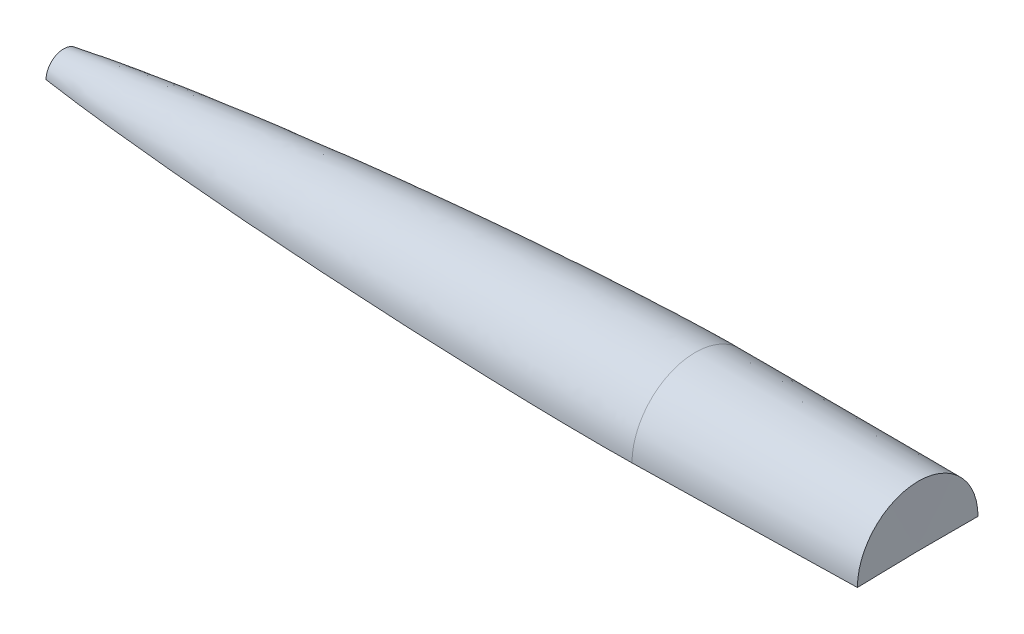
ISO-10303-21;
HEADER;
FILE_DESCRIPTION(('STEP AP214'),'2;1');
FILE_NAME('part.step','',(''),(''),'','','');
FILE_SCHEMA(('AUTOMOTIVE_DESIGN { 1 0 10303 214 1 1 1 1 }'));
ENDSEC;
DATA;
#1=APPLICATION_CONTEXT('core data for automotive mechanical design processes');
#2=APPLICATION_PROTOCOL_DEFINITION('international standard','automotive_design',2000,#1);
#3=PRODUCT_CONTEXT('',#1,'mechanical');
#4=PRODUCT('Part','Part','',(#3));
#5=PRODUCT_RELATED_PRODUCT_CATEGORY('part','',(#4));
#6=PRODUCT_DEFINITION_FORMATION('','',#4);
#7=PRODUCT_DEFINITION_CONTEXT('part definition',#1,'design');
#8=PRODUCT_DEFINITION('design','',#6,#7);
#9=PRODUCT_DEFINITION_SHAPE('','',#8);
#10=(LENGTH_UNIT() NAMED_UNIT(*) SI_UNIT(.MILLI.,.METRE.));
#11=(NAMED_UNIT(*) PLANE_ANGLE_UNIT() SI_UNIT($,.RADIAN.));
#12=(NAMED_UNIT(*) SI_UNIT($,.STERADIAN.) SOLID_ANGLE_UNIT());
#13=UNCERTAINTY_MEASURE_WITH_UNIT(LENGTH_MEASURE(1.E-05),#10,'distance_accuracy_value','');
#14=(GEOMETRIC_REPRESENTATION_CONTEXT(3) GLOBAL_UNCERTAINTY_ASSIGNED_CONTEXT((#13)) GLOBAL_UNIT_ASSIGNED_CONTEXT((#10,
#11,#12)) REPRESENTATION_CONTEXT('',''));
#15=CARTESIAN_POINT('',(0.,0.,0.));
#16=DIRECTION('',(0.,0.,1.));
#17=DIRECTION('',(1.,0.,0.));
#18=AXIS2_PLACEMENT_3D('',#15,#16,#17);
#19=CARTESIAN_POINT('',(85.2832414742339,0.,9.93858182353595));
#20=DIRECTION('',(-0.999941138636794,0.,0.0108498507709177));
#21=DIRECTION('',(0.0108498507709177,0.,0.999941138636794));
#22=AXIS2_PLACEMENT_3D('',#19,#20,#21);
#23=CONICAL_SURFACE('',#22,21.6958521235403,1.41154456510451);
#24=CARTESIAN_POINT('',(87.6480523424266,-0.000200000000151501,17.3896605987785));
#25=CARTESIAN_POINT('',(87.6480526553151,0.210415281306257,17.3896888757842));
#26=CARTESIAN_POINT('',(87.6479537572972,0.421027540842986,17.3807878736566));
#27=CARTESIAN_POINT('',(87.6475593475226,0.840745714185644,17.3452908831575));
#28=CARTESIAN_POINT('',(87.6472638452042,1.04985169981512,17.3186957442159));
#29=CARTESIAN_POINT('',(87.6464783113491,1.46493128724422,17.2479989316907));
#30=CARTESIAN_POINT('',(87.6459884169852,1.6709069917376,17.2039096028855));
#31=CARTESIAN_POINT('',(87.6448176461269,2.07841149002968,17.098545280126));
#32=CARTESIAN_POINT('',(87.644136771948,2.27994033771274,17.0372704945384));
#33=CARTESIAN_POINT('',(87.6425886086647,2.67717925033431,16.8979484522448));
#34=CARTESIAN_POINT('',(87.6417212658155,2.87288761911996,16.8198963599188));
#35=CARTESIAN_POINT('',(87.6398060694397,3.25710491527235,16.6475537315265));
#36=CARTESIAN_POINT('',(87.6387581493413,3.44561115606781,16.5532572067662));
#37=CARTESIAN_POINT('',(87.6364898805273,3.81393535129549,16.349156116946));
#38=CARTESIAN_POINT('',(87.6352695989856,3.99375665400958,16.239357593426));
#39=CARTESIAN_POINT('',(87.6326649167601,4.34351419852241,16.00500365783));
#40=CARTESIAN_POINT('',(87.631280513521,4.51345028635001,15.8804480159902));
#41=CARTESIAN_POINT('',(87.628357346615,4.84223308328939,15.6174615809414));
#42=CARTESIAN_POINT('',(87.6268185769678,5.00107936237288,15.4790302501828));
#43=CARTESIAN_POINT('',(87.6235975798958,5.30655009260982,15.1892771506882));
#44=CARTESIAN_POINT('',(87.6219153490837,5.45317425503821,15.0379550776028));
#45=CARTESIAN_POINT('',(87.6184194331488,5.7331500640402,14.7235041632565));
#46=CARTESIAN_POINT('',(87.6166057522642,5.86650213821614,14.5603757026684));
#47=CARTESIAN_POINT('',(87.6128590874273,6.11903540570978,14.22340878024));
#48=CARTESIAN_POINT('',(87.6109260623726,6.23821167502938,14.0495666286211));
#49=CARTESIAN_POINT('',(87.6069556666006,6.46145403096587,13.6925211562301));
#50=CARTESIAN_POINT('',(87.6049183318822,6.5655252836356,13.5093210650763));
#51=CARTESIAN_POINT('',(87.6007523818254,6.75790233454696,13.1347378934686));
#52=CARTESIAN_POINT('',(87.5986237331649,6.84620231580727,12.9433518258747));
#53=CARTESIAN_POINT('',(87.5942915230514,7.00634123259561,12.5538713302434));
#54=CARTESIAN_POINT('',(87.5920879810968,7.07818441550769,12.3557786483199));
#55=CARTESIAN_POINT('',(87.5876210504409,7.2049298367242,11.9542418180736));
#56=CARTESIAN_POINT('',(87.5853576604693,7.25983171512406,11.7507975561605));
#57=CARTESIAN_POINT('',(87.5807869988764,7.35230530566724,11.339994558888));
#58=CARTESIAN_POINT('',(87.5784797244466,7.389875904727,11.1326355729997));
#59=CARTESIAN_POINT('',(87.5738378190722,7.4474147925648,10.7154896517117));
#60=CARTESIAN_POINT('',(87.5715031880899,7.46738305715052,10.5057027129756));
#61=CARTESIAN_POINT('',(87.5668230832784,7.48957565631046,10.085185522886));
#62=CARTESIAN_POINT('',(87.5644776090923,7.49179940241313,9.87445524047966));
#63=CARTESIAN_POINT('',(87.5597926185946,7.47848576328997,9.45356091703578));
#64=CARTESIAN_POINT('',(87.5574531021578,7.46294875469947,9.24339686408548));
#65=CARTESIAN_POINT('',(87.5527961471814,7.41421972325694,8.82508252300462));
#66=CARTESIAN_POINT('',(87.5504787131656,7.38102415880809,8.6169326473668));
#67=CARTESIAN_POINT('',(87.5458836887959,7.29722630923078,8.20424115738842));
#68=CARTESIAN_POINT('',(87.5436060849731,7.24663003273592,7.99969832309921));
#69=CARTESIAN_POINT('',(87.5391057000455,7.12837705328439,7.59556427874549));
#70=CARTESIAN_POINT('',(87.5368829289407,7.06071726328038,7.39597397185239));
#71=CARTESIAN_POINT('',(87.5325085193619,6.90882446207005,7.0032071370691));
#72=CARTESIAN_POINT('',(87.530356879229,6.82459183770183,6.8100304595969));
#73=CARTESIAN_POINT('',(87.5261399363026,6.64014793770979,6.43145310921139));
#74=CARTESIAN_POINT('',(87.5240746364046,6.53993612677,6.24605269707232));
#75=CARTESIAN_POINT('',(87.5200452047681,6.324249904479,5.8843559551675));
#76=CARTESIAN_POINT('',(87.5180810714492,6.20877573164065,5.7080594831896));
#77=CARTESIAN_POINT('',(87.5142676719893,5.96336681153742,5.36579662851766));
#78=CARTESIAN_POINT('',(87.5124184223148,5.83342999872927,5.19983172666203));
#79=CARTESIAN_POINT('',(87.5088489531208,5.56008375618047,4.87949930200038));
#80=CARTESIAN_POINT('',(87.5071286862114,5.41667931868737,4.72512751968741));
#81=CARTESIAN_POINT('',(87.5038284080541,5.11734982315833,4.42898476219655));
#82=CARTESIAN_POINT('',(87.5022484216208,4.96142255918056,4.28721601639753));
#83=CARTESIAN_POINT('',(87.4992408468102,4.63823396239048,4.01736495235889));
#84=CARTESIAN_POINT('',(87.497813205904,4.47097656894531,3.88927791664152));
#85=CARTESIAN_POINT('',(87.4951192016854,4.12618051164247,3.64758315685438));
#86=CARTESIAN_POINT('',(87.4938529204051,3.94863668456015,3.53398279749386));
#87=CARTESIAN_POINT('',(87.4914915677112,3.58461300885287,3.32214889217062));
#88=CARTESIAN_POINT('',(87.4903964910751,3.3981334330303,3.22391487747371));
#89=CARTESIAN_POINT('',(87.4883847502724,3.01745056491863,3.04345654548871));
#90=CARTESIAN_POINT('',(87.48746818892,2.82324289878656,2.96124145414801));
#91=CARTESIAN_POINT('',(87.4858208396304,2.42858975201066,2.81347843627318));
#92=CARTESIAN_POINT('',(87.48509004765,2.22814440723753,2.74793014698339));
#93=CARTESIAN_POINT('',(87.4838202597041,1.82270576250795,2.63403861273785));
#94=CARTESIAN_POINT('',(87.4832810196751,1.61771860600182,2.58567347406992));
#95=CARTESIAN_POINT('',(87.482397085506,1.20448072951114,2.50639312559181));
#96=CARTESIAN_POINT('',(87.4820522958786,0.996231663056058,2.47546935098199));
#97=CARTESIAN_POINT('',(87.481651641886,0.656241349420404,2.43953533770414));
#98=CARTESIAN_POINT('',(87.481535936016,0.525044113814339,2.42915792137693));
#99=CARTESIAN_POINT('',(87.4813818409092,0.262502439870407,2.41533748528493));
#100=CARTESIAN_POINT('',(87.4813433241502,0.131158603599644,2.41188302827192));
#101=CARTESIAN_POINT('',(87.4813433802164,-0.000200000000151515,2.41188804094604));
#102=B_SPLINE_CURVE_WITH_KNOTS('',3,(#24,#25,#26,#27,#28,#29,#30,#31,#32,#33,#34,#35,#36,#37,
#38,#39,#40,#41,#42,#43,#44,#45,#46,#47,#48,#49,#50,#51,#52,#53,#54,#55,#56,#57,#58,#59,#60,#61,
#62,#63,#64,#65,#66,#67,#68,#69,#70,#71,#72,#73,#74,#75,#76,#77,#78,#79,#80,#81,#82,#83,#84,#85,
#86,#87,#88,#89,#90,#91,#92,#93,#94,#95,#96,#97,#98,#99,#100,#101),.UNSPECIFIED.,.F.,.F.,(4,2,2,
2,2,2,2,2,2,2,2,2,2,2,2,2,2,2,2,2,2,2,2,2,2,2,2,2,2,2,2,2,2,2,2,2,2,2,4),(0.,0.631652981165051,
1.26327564120089,1.89445338697916,2.52562348031841,3.15697573645456,3.78856124781162,
4.41990128954022,5.05125116232801,5.68262550331749,6.31401475514209,6.94538365817347,
7.57697123214299,8.20834228583879,8.83994573192171,9.47138598145941,10.1028396445202,
10.7343338563972,11.365828936187,11.9973449585201,12.6288475891452,13.2604769216032,
13.8918883649944,14.5234141223017,15.1549251404742,15.7864573192352,16.4179796298813,
17.0495922500764,17.6809716581375,18.312462530976,18.9437349569636,19.5753270393901,
20.2068998520052,20.8388353447083,21.4707570820546,22.1018707514676,22.732674234196,
23.1273275190851,23.5213282678744),.UNSPECIFIED.);
#103=CARTESIAN_POINT('',(87.6480523424563,0.,17.3896606014491));
#104=VERTEX_POINT('',#103);
#105=CARTESIAN_POINT('',(87.4813433801873,0.,2.41188803827542));
#106=VERTEX_POINT('',#105);
#107=EDGE_CURVE('E91',#104,#106,#102,.T.);
#108=ORIENTED_EDGE('',*,*,#107,.F.);
#109=DIRECTION('',(0.147857587515128,0.,-0.989008662153273));
#110=VECTOR('',#109,1.);
#111=CARTESIAN_POINT('',(88.7676468426298,0.,9.90077431986226));
#112=LINE('',#111,#110);
#113=CARTESIAN_POINT('',(85.5186382321224,-1.51501325639282E-13,31.6331568996443));
#114=VERTEX_POINT('',#113);
#115=EDGE_CURVE('E97',#114,#104,#112,.T.);
#116=ORIENTED_EDGE('',*,*,#115,.F.);
#117=CARTESIAN_POINT('',(85.2832414742339,0.,9.93858182353595));
#118=DIRECTION('',(-0.999941138636794,0.,0.0108498507709177));
#119=DIRECTION('',(0.0108498507709177,0.,0.999941138636794));
#120=AXIS2_PLACEMENT_3D('',#117,#118,#119);
#121=CIRCLE('',#120,21.6958521235403);
#122=CARTESIAN_POINT('',(85.0478447163463,0.,-11.7559932525724));
#123=VERTEX_POINT('',#122);
#124=EDGE_CURVE('E86',#114,#123,#121,.T.);
#125=ORIENTED_EDGE('',*,*,#124,.T.);
#126=DIRECTION('',(0.169282705698987,0.,0.985567534749004));
#127=VECTOR('',#126,1.);
#128=CARTESIAN_POINT('',(88.7676468426303,0.,9.90077431986226));
#129=LINE('',#128,#127);
#130=EDGE_CURVE('E120',#123,#106,#129,.T.);
#131=ORIENTED_EDGE('',*,*,#130,.T.);
#132=EDGE_LOOP('',(#108,#116,#125,#131));
#133=FACE_BOUND('',#132,.T.);
#134=ADVANCED_FACE('F33',(#133),#23,.F.);
#135=CARTESIAN_POINT('',(468.501456449085,-4.30429188083782E-13,67.4240146336954));
#136=DIRECTION('',(0.,-1.,0.));
#137=DIRECTION('',(-0.0216984242678215,0.,-0.999764561476498));
#138=AXIS2_PLACEMENT_3D('',#135,#136,#137);
#139=PLANE('',#138);
#140=ORIENTED_EDGE('',*,*,#115,.T.);
#141=DIRECTION('',(-1.,0.,0.));
#142=VECTOR('',#141,1.);
#143=CARTESIAN_POINT('',(314.706000000001,0.,17.3896606014491));
#144=LINE('',#143,#142);
#145=CARTESIAN_POINT('',(314.706000000001,0.,17.3896606014491));
#146=VERTEX_POINT('',#145);
#147=EDGE_CURVE('E11',#104,#146,#144,.F.);
#148=ORIENTED_EDGE('',*,*,#147,.T.);
#149=DIRECTION('',(0.,0.,1.));
#150=VECTOR('',#149,1.);
#151=CARTESIAN_POINT('',(314.706000000001,-4.18777013281705E-13,67.4240146336954));
#152=LINE('',#151,#150);
#153=CARTESIAN_POINT('',(314.706000000001,0.,2.41188803827543));
#154=VERTEX_POINT('',#153);
#155=EDGE_CURVE('E82',#154,#146,#152,.T.);
#156=ORIENTED_EDGE('',*,*,#155,.F.);
#157=DIRECTION('',(-1.,0.,0.));
#158=VECTOR('',#157,1.);
#159=CARTESIAN_POINT('',(314.706000000001,0.,2.41188803827542));
#160=LINE('',#159,#158);
#161=EDGE_CURVE('E41',#154,#106,#160,.T.);
#162=ORIENTED_EDGE('',*,*,#161,.T.);
#163=ORIENTED_EDGE('',*,*,#130,.F.);
#164=CARTESIAN_POINT('',(851.304580950282,0.,-76.1999999830612));
#165=CARTESIAN_POINT('',(848.604594276337,0.,-76.2013219129743));
#166=CARTESIAN_POINT('',(843.204698036428,0.,-76.1660349983795));
#167=CARTESIAN_POINT('',(832.405478937972,0.,-76.0378907584847));
#168=CARTESIAN_POINT('',(814.624980968994,0.,-75.6938189446404));
#169=CARTESIAN_POINT('',(792.56509769967,0.,-75.1093999668115));
#170=CARTESIAN_POINT('',(759.248611408171,0.,-73.992649860006));
#171=CARTESIAN_POINT('',(724.359891248075,0.,-72.534917853722));
#172=CARTESIAN_POINT('',(689.4818891808,0.,-70.8434913147738));
#173=CARTESIAN_POINT('',(647.641366115943,0.,-68.5634656214354));
#174=CARTESIAN_POINT('',(612.785340126742,0.,-66.4682371905843));
#175=CARTESIAN_POINT('',(577.94073898453,0.,-64.1913363512685));
#176=CARTESIAN_POINT('',(543.108107681937,0.,-61.7397439146533));
#177=CARTESIAN_POINT('',(515.249450887889,0.,-59.6753861650244));
#178=CARTESIAN_POINT('',(487.398559467614,0.,-57.5087840183481));
#179=CARTESIAN_POINT('',(459.55581534976,0.,-55.2398820829972));
#180=CARTESIAN_POINT('',(431.721669201162,0.,-52.8677956970107));
#181=CARTESIAN_POINT('',(403.89666678628,0.,-50.3907530559097));
#182=CARTESIAN_POINT('',(376.081450756032,0.,-47.80604215935));
#183=CARTESIAN_POINT('',(348.276817570687,0.,-45.1098832754561));
#184=CARTESIAN_POINT('',(320.483705769577,0.,-42.2972398123971));
#185=CARTESIAN_POINT('',(292.703329318698,0.,-39.361555725817));
#186=CARTESIAN_POINT('',(264.937120956625,0.,-36.2943227731371));
#187=CARTESIAN_POINT('',(237.187067415558,0.,-33.0845211743661));
#188=CARTESIAN_POINT('',(212.921947060124,0.,-30.1384681896362));
#189=CARTESIAN_POINT('',(192.13714102651,0.,-27.5029564807863));
#190=CARTESIAN_POINT('',(174.826871572784,0.,-25.2246560341365));
#191=CARTESIAN_POINT('',(160.98620549934,0.,-23.3487950499337));
#192=CARTESIAN_POINT('',(148.881759565782,0.,-21.6563308432943));
#193=CARTESIAN_POINT('',(138.513733131288,0.,-20.1657112781232));
#194=CARTESIAN_POINT('',(129.875476740705,0.,-18.893918943189));
#195=CARTESIAN_POINT('',(122.97234892004,0.,-17.8586913852302));
#196=CARTESIAN_POINT('',(116.925319179086,0.,-16.9338921590306));
#197=CARTESIAN_POINT('',(111.760486229086,0.,-16.1307134136344));
#198=CARTESIAN_POINT('',(107.431246219697,0.,-15.4474404699468));
#199=CARTESIAN_POINT('',(104.017067052322,0.,-14.9032668481449));
#200=CARTESIAN_POINT('',(100.505753232817,0.,-14.3361510709931));
#201=CARTESIAN_POINT('',(97.1703246727495,0.,-13.7927159762813));
#202=CARTESIAN_POINT('',(93.5370616124189,0.,-13.1912958461169));
#203=CARTESIAN_POINT('',(90.4166105959484,0.,-12.6708073688816));
#204=CARTESIAN_POINT('',(87.4028362576501,0.,-12.1591367577616));
#205=CARTESIAN_POINT('',(85.8325870913336,0.,-11.890781897519));
#206=CARTESIAN_POINT('',(85.0478447425106,0.,-11.7559932570664));
#207=B_SPLINE_CURVE_WITH_KNOTS('',4,(#164,#165,#166,#167,#168,#169,#170,#171,#172,#173,#174,
#175,#176,#177,#178,#179,#180,#181,#182,#183,#184,#185,#186,#187,#188,#189,#190,#191,#192,#193,
#194,#195,#196,#197,#198,#199,#200,#201,#202,#203,#204,#205,#206),.UNSPECIFIED.,.F.,.F.,(5,1,1,
1,1,1,1,1,1,1,1,1,1,1,1,1,1,1,1,1,1,1,1,1,1,1,1,1,1,1,1,1,1,1,1,1,1,1,1,5),(0.0879001619214621,
0.100701312225803,0.113502462530143,0.139104763138825,0.172216118418551,0.205327473698278,
0.271550183817795,0.30466153934024,0.337772894862686,0.403995604811727,0.437106960211499,
0.47021831561127,0.503329670637559,0.536441025663847,0.569552381231309,0.602663736798771,
0.635775091550015,0.668886446301259,0.701997801637405,0.735109156973551,0.768220512578417,
0.801331868183284,0.834443222794012,0.867554577404739,0.884110254697725,0.900665931990712,
0.917221609283698,0.933777286576684,0.942055125749807,0.95033296492293,0.958610804096053,
0.966888643269176,0.971027562855737,0.975166482442299,0.97930540202886,0.983444321615422,
0.987583241201983,0.991722160788545,0.995861080375106,1.),.UNSPECIFIED.);
#208=CARTESIAN_POINT('',(851.304580923926,0.,-76.1999999808446));
#209=VERTEX_POINT('',#208);
#210=EDGE_CURVE('E123',#209,#123,#207,.T.);
#211=ORIENTED_EDGE('',*,*,#210,.F.);
#212=DIRECTION('',(-1.,0.,0.));
#213=VECTOR('',#212,1.);
#214=CARTESIAN_POINT('',(851.304580923926,0.,-76.1999999808446));
#215=LINE('',#214,#213);
#216=CARTESIAN_POINT('',(1122.35148772108,0.,-76.1999999808446));
#217=VERTEX_POINT('',#216);
#218=EDGE_CURVE('E106',#217,#209,#215,.T.);
#219=ORIENTED_EDGE('',*,*,#218,.F.);
#220=DIRECTION('',(0.,0.,-1.));
#221=VECTOR('',#220,1.);
#222=CARTESIAN_POINT('',(1122.35148772108,0.,-1.31411623664723));
#223=LINE('',#222,#221);
#224=CARTESIAN_POINT('',(1122.35148772108,0.,-1.31411623664722));
#225=VERTEX_POINT('',#224);
#226=EDGE_CURVE('E122',#225,#217,#223,.T.);
#227=ORIENTED_EDGE('',*,*,#226,.F.);
#228=DIRECTION('',(0.0216984242678186,0.,0.999764561476498));
#229=VECTOR('',#228,1.);
#230=CARTESIAN_POINT('',(1122.35148772108,0.,-1.31411623664722));
#231=LINE('',#230,#229);
#232=CARTESIAN_POINT('',(1123.97639339823,-5.2289455117343E-13,73.5541364856503));
#233=VERTEX_POINT('',#232);
#234=EDGE_CURVE('E101',#225,#233,#231,.T.);
#235=ORIENTED_EDGE('',*,*,#234,.T.);
#236=DIRECTION('',(-0.999764561476498,0.,0.0216984242678215));
#237=VECTOR('',#236,1.);
#238=CARTESIAN_POINT('',(852.993301484615,-5.43430176935614E-13,79.4354272658155));
#239=LINE('',#238,#237);
#240=CARTESIAN_POINT('',(852.993301484615,-5.43430176935614E-13,79.4354272658155));
#241=VERTEX_POINT('',#240);
#242=EDGE_CURVE('E104',#233,#241,#239,.T.);
#243=ORIENTED_EDGE('',*,*,#242,.T.);
#244=CARTESIAN_POINT('',(852.993301511013,-5.43430176949094E-13,79.4354272674598));
#245=CARTESIAN_POINT('',(850.293979201739,-5.43643969461433E-13,79.4953343425083));
#246=CARTESIAN_POINT('',(844.894588634984,-5.43806695052536E-13,79.5772249754284));
#247=CARTESIAN_POINT('',(834.095131560643,-5.43730114426701E-13,79.6834369433836));
#248=CARTESIAN_POINT('',(816.311353989659,-5.42674738694252E-13,79.7252549259232));
#249=CARTESIAN_POINT('',(794.243983495749,-5.40265350263751E-13,79.619638249312));
#250=CARTESIAN_POINT('',(760.911109470972,-5.34991778660453E-13,79.2260663231687));
#251=CARTESIAN_POINT('',(725.998972972097,-5.27456402220743E-13,78.525707775351));
#252=CARTESIAN_POINT('',(691.092481239471,-5.18288429589466E-13,77.5914771498395));
#253=CARTESIAN_POINT('',(649.212336080751,-5.05538042118876E-13,76.2198616834327));
#254=CARTESIAN_POINT('',(614.319053387414,-4.93548836922778E-13,74.8814473902736));
#255=CARTESIAN_POINT('',(579.433250846219,-4.80290229157733E-13,73.3611555601563));
#256=CARTESIAN_POINT('',(544.555624794088,-4.65810921407391E-13,71.6659535352129));
#257=CARTESIAN_POINT('',(516.658733690771,-4.53507122937055E-13,70.2065707695734));
#258=CARTESIAN_POINT('',(488.767387590652,-4.40488809346735E-13,68.6447991827818));
#259=CARTESIAN_POINT('',(460.881967130548,-4.26755564925048E-13,66.980575109002));
#260=CARTESIAN_POINT('',(433.002903675419,-4.12301178329793E-13,65.2130043157968));
#261=CARTESIAN_POINT('',(405.130704415866,-3.97113236495323E-13,63.340303573609));
#262=CARTESIAN_POINT('',(377.265953005368,-3.81172754049289E-13,61.359747576092));
#263=CARTESIAN_POINT('',(349.40936370245,-3.64453278475544E-13,59.2675401993316));
#264=CARTESIAN_POINT('',(321.561765539371,-3.46919570403894E-13,57.0586256724802));
#265=CARTESIAN_POINT('',(293.724229940478,-3.28525759940952E-13,54.7264231535778));
#266=CARTESIAN_POINT('',(265.89800469157,-3.09212329293301E-13,52.2623953150446));
#267=CARTESIAN_POINT('',(238.08483694523,-2.88902181754984E-13,49.6554818624115));
#268=CARTESIAN_POINT('',(213.761504826327,-2.7016963970029E-13,47.2366373684285));
#269=CARTESIAN_POINT('',(192.924405885535,-2.53341785251468E-13,45.0527437002057));
#270=CARTESIAN_POINT('',(175.568776406391,-2.38744931743984E-13,43.1505852240464));
#271=CARTESIAN_POINT('',(161.690665731429,-2.26695261181586E-13,41.5754865343949));
#272=CARTESIAN_POINT('',(149.552345844334,-2.15794624929653E-13,40.1460682024226));
#273=CARTESIAN_POINT('',(139.154416346929,-2.06171821046483E-13,38.8807694229167));
#274=CARTESIAN_POINT('',(130.490597845012,-1.97945935125325E-13,37.7967130689891));
#275=CARTESIAN_POINT('',(123.566632479803,-1.91240414518526E-13,36.9115162397058));
#276=CARTESIAN_POINT('',(117.50095975663,-1.85241103938886E-13,36.1181457637499));
#277=CARTESIAN_POINT('',(112.319915094093,-1.80024175799744E-13,35.4272248541932));
#278=CARTESIAN_POINT('',(107.976868408357,-1.75581188164672E-13,34.8380504657595));
#279=CARTESIAN_POINT('',(104.551685360163,-1.72040139965407E-13,34.3680872714917));
#280=CARTESIAN_POINT('',(101.028892720457,-1.68346256301215E-13,33.8772949922343));
#281=CARTESIAN_POINT('',(97.6824577635184,-1.64804398436379E-13,33.4063613870901));
#282=CARTESIAN_POINT('',(94.0370002441308,-1.60880222230263E-13,32.8839189377528));
#283=CARTESIAN_POINT('',(90.9059901222347,-1.57482302726419E-13,32.4312618736184));
#284=CARTESIAN_POINT('',(87.8818228965113,-1.54137872165344E-13,31.9851058837116));
#285=CARTESIAN_POINT('',(86.3061205497281,-1.52383039012467E-13,31.7508861371579));
#286=CARTESIAN_POINT('',(85.5186382583781,-1.51501325668679E-13,31.6331569035695));
#287=B_SPLINE_CURVE_WITH_KNOTS('',4,(#244,#245,#246,#247,#248,#249,#250,#251,#252,#253,#254,
#255,#256,#257,#258,#259,#260,#261,#262,#263,#264,#265,#266,#267,#268,#269,#270,#271,#272,#273,
#274,#275,#276,#277,#278,#279,#280,#281,#282,#283,#284,#285,#286),.UNSPECIFIED.,.F.,.F.,(5,1,1,
1,1,1,1,1,1,1,1,1,1,1,1,1,1,1,1,1,1,1,1,1,1,1,1,1,1,1,1,1,1,1,1,1,1,1,1,5),(0.0879001619214621,
0.100701312225803,0.113502462530143,0.139104763138825,0.172216118418551,0.205327473698278,
0.271550183817795,0.30466153934024,0.337772894862686,0.403995604811727,0.437106960211499,
0.47021831561127,0.503329670637559,0.536441025663847,0.569552381231309,0.602663736798771,
0.635775091550015,0.668886446301259,0.701997801637405,0.735109156973551,0.768220512578417,
0.801331868183284,0.834443222794012,0.867554577404739,0.884110254697725,0.900665931990712,
0.917221609283698,0.933777286576684,0.942055125749807,0.95033296492293,0.958610804096053,
0.966888643269176,0.971027562855737,0.975166482442299,0.97930540202886,0.983444321615422,
0.987583241201983,0.991722160788545,0.995861080375106,1.),.UNSPECIFIED.);
#288=EDGE_CURVE('E99',#241,#114,#287,.T.);
#289=ORIENTED_EDGE('',*,*,#288,.T.);
#290=EDGE_LOOP('',(#140,#148,#156,#162,#163,#211,#219,#227,#235,#243,#289));
#291=FACE_BOUND('',#290,.T.);
#292=ADVANCED_FACE('F94',(#291),#139,.T.);
#293=CARTESIAN_POINT('',(1122.35148772108,0.,-1.31411623664723));
#294=DIRECTION('',(-0.999941138636794,0.,0.0108498507709177));
#295=AXIS1_PLACEMENT('',#293,#294);
#296=SURFACE_OF_REVOLUTION('',#287,#295);
#297=ORIENTED_EDGE('',*,*,#124,.F.);
#298=ORIENTED_EDGE('',*,*,#288,.F.);
#299=CARTESIAN_POINT('',(852.14894120427,0.,1.61771364248546));
#300=DIRECTION('',(-0.999941138636794,0.,0.0108498507709177));
#301=DIRECTION('',(0.0108498507709177,0.,0.999941138636794));
#302=AXIS2_PLACEMENT_3D('',#299,#300,#301);
#303=CIRCLE('',#302,77.8222943496633);
#304=EDGE_CURVE('E55',#241,#209,#303,.T.);
#305=ORIENTED_EDGE('',*,*,#304,.T.);
#306=ORIENTED_EDGE('',*,*,#210,.T.);
#307=EDGE_LOOP('',(#297,#298,#305,#306));
#308=FACE_BOUND('',#307,.T.);
#309=ADVANCED_FACE('F135',(#308),#296,.T.);
#310=CARTESIAN_POINT('',(1122.35148772108,0.,-1.31411623664723));
#311=DIRECTION('',(0.999941138636794,0.,-0.0108498507709177));
#312=DIRECTION('',(-0.0108498507709177,0.,-0.999941138636794));
#313=AXIS2_PLACEMENT_3D('',#310,#311,#312);
#314=CONICAL_SURFACE('',#313,0.,1.55994626313997);
#315=CARTESIAN_POINT('',(1123.16394055965,0.,-1.32293174759718));
#316=DIRECTION('',(-0.999941138636794,0.,0.0108498507709177));
#317=DIRECTION('',(0.0108498507709177,0.,0.999941138636794));
#318=AXIS2_PLACEMENT_3D('',#315,#316,#317);
#319=CIRCLE('',#318,74.8814758589954);
#320=EDGE_CURVE('E115',#233,#217,#319,.T.);
#321=ORIENTED_EDGE('',*,*,#320,.F.);
#322=ORIENTED_EDGE('',*,*,#234,.F.);
#323=ORIENTED_EDGE('',*,*,#226,.T.);
#324=EDGE_LOOP('',(#321,#322,#323));
#325=FACE_BOUND('',#324,.T.);
#326=ADVANCED_FACE('F137',(#325),#314,.F.);
#327=CARTESIAN_POINT('',(1123.16394055965,0.,-1.32293174759718));
#328=DIRECTION('',(-0.999941138636794,0.,0.0108498507709177));
#329=DIRECTION('',(0.0108498507709177,0.,0.999941138636794));
#330=AXIS2_PLACEMENT_3D('',#327,#328,#329);
#331=CONICAL_SURFACE('',#330,74.8814758589953,0.0108500636549323);
#332=ORIENTED_EDGE('',*,*,#242,.F.);
#333=ORIENTED_EDGE('',*,*,#320,.T.);
#334=ORIENTED_EDGE('',*,*,#218,.T.);
#335=ORIENTED_EDGE('',*,*,#304,.F.);
#336=EDGE_LOOP('',(#332,#333,#334,#335));
#337=FACE_BOUND('',#336,.T.);
#338=ADVANCED_FACE('F132',(#337),#331,.T.);
#339=CARTESIAN_POINT('',(314.706000000001,0.,9.90077431986226));
#340=DIRECTION('',(-1.,0.,0.));
#341=DIRECTION('',(0.,0.,1.));
#342=AXIS2_PLACEMENT_3D('',#339,#340,#341);
#343=CYLINDRICAL_SURFACE('',#342,7.48888628158684);
#344=ORIENTED_EDGE('',*,*,#107,.T.);
#345=ORIENTED_EDGE('',*,*,#161,.F.);
#346=CARTESIAN_POINT('',(314.706000000001,0.,9.90077431986226));
#347=DIRECTION('',(1.,0.,0.));
#348=DIRECTION('',(0.,0.,-1.));
#349=AXIS2_PLACEMENT_3D('',#346,#347,#348);
#350=CIRCLE('',#349,7.48888628158684);
#351=EDGE_CURVE('E47',#154,#146,#350,.T.);
#352=ORIENTED_EDGE('',*,*,#351,.T.);
#353=ORIENTED_EDGE('',*,*,#147,.F.);
#354=EDGE_LOOP('',(#344,#345,#352,#353));
#355=FACE_BOUND('',#354,.T.);
#356=ADVANCED_FACE('F89',(#355),#343,.F.);
#357=CARTESIAN_POINT('',(314.706000000001,0.,9.90077431986226));
#358=DIRECTION('',(1.,0.,0.));
#359=DIRECTION('',(0.,0.,-1.));
#360=AXIS2_PLACEMENT_3D('',#357,#358,#359);
#361=PLANE('',#360);
#362=ORIENTED_EDGE('',*,*,#155,.T.);
#363=ORIENTED_EDGE('',*,*,#351,.F.);
#364=EDGE_LOOP('',(#362,#363));
#365=FACE_BOUND('',#364,.T.);
#366=ADVANCED_FACE('F83',(#365),#361,.F.);
#367=CLOSED_SHELL('',(#134,#292,#309,#326,#338,#356,#366));
#368=MANIFOLD_SOLID_BREP('B2',#367);
#369=ADVANCED_BREP_SHAPE_REPRESENTATION('',(#18,#368),#14);
#370=SHAPE_DEFINITION_REPRESENTATION(#9,#369);
ENDSEC;
END-ISO-10303-21;
